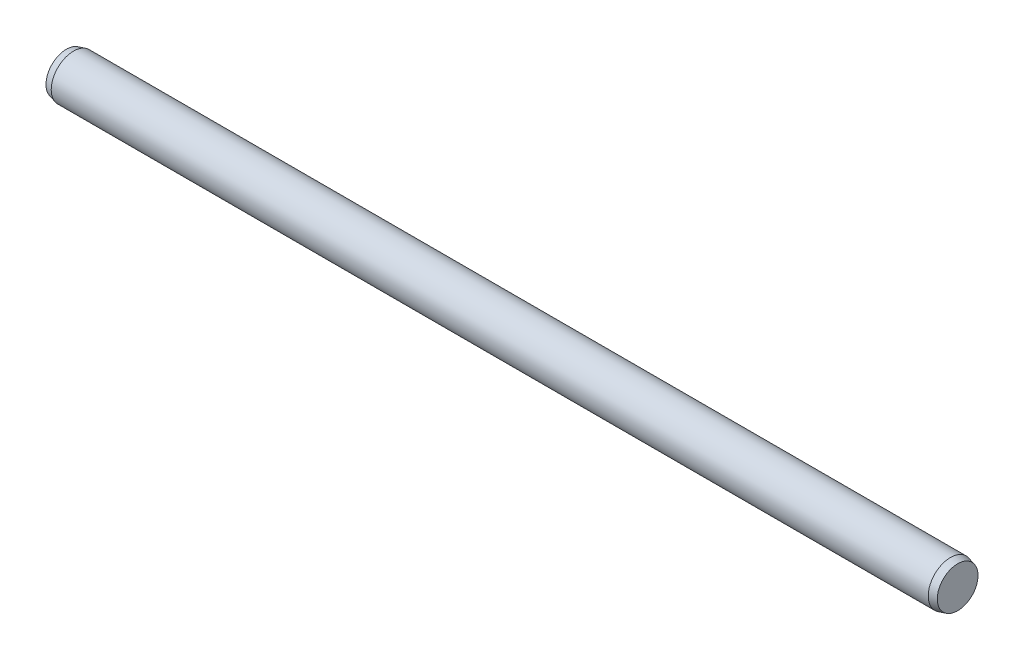
ISO-10303-21;
HEADER;
FILE_DESCRIPTION(('STEP AP214'),'2;1');
FILE_NAME('part.step','',(''),(''),'','','');
FILE_SCHEMA(('AUTOMOTIVE_DESIGN { 1 0 10303 214 1 1 1 1 }'));
ENDSEC;
DATA;
#1=APPLICATION_CONTEXT('core data for automotive mechanical design processes');
#2=APPLICATION_PROTOCOL_DEFINITION('international standard','automotive_design',2000,#1);
#3=PRODUCT_CONTEXT('',#1,'mechanical');
#4=PRODUCT('Part','Part','',(#3));
#5=PRODUCT_RELATED_PRODUCT_CATEGORY('part','',(#4));
#6=PRODUCT_DEFINITION_FORMATION('','',#4);
#7=PRODUCT_DEFINITION_CONTEXT('part definition',#1,'design');
#8=PRODUCT_DEFINITION('design','',#6,#7);
#9=PRODUCT_DEFINITION_SHAPE('','',#8);
#10=(LENGTH_UNIT() NAMED_UNIT(*) SI_UNIT(.MILLI.,.METRE.));
#11=(NAMED_UNIT(*) PLANE_ANGLE_UNIT() SI_UNIT($,.RADIAN.));
#12=(NAMED_UNIT(*) SI_UNIT($,.STERADIAN.) SOLID_ANGLE_UNIT());
#13=UNCERTAINTY_MEASURE_WITH_UNIT(LENGTH_MEASURE(1.E-05),#10,'distance_accuracy_value','');
#14=(GEOMETRIC_REPRESENTATION_CONTEXT(3) GLOBAL_UNCERTAINTY_ASSIGNED_CONTEXT((#13)) GLOBAL_UNIT_ASSIGNED_CONTEXT((#10,
#11,#12)) REPRESENTATION_CONTEXT('',''));
#15=CARTESIAN_POINT('',(0.,0.,0.));
#16=DIRECTION('',(0.,0.,1.));
#17=DIRECTION('',(1.,0.,0.));
#18=AXIS2_PLACEMENT_3D('',#15,#16,#17);
#19=CARTESIAN_POINT('',(-49.2,0.,0.));
#20=DIRECTION('',(1.,0.,0.));
#21=DIRECTION('',(0.,0.,-1.));
#22=AXIS2_PLACEMENT_3D('',#19,#20,#21);
#23=CYLINDRICAL_SURFACE('',#22,2.5);
#24=CARTESIAN_POINT('',(-49.2,0.,0.));
#25=DIRECTION('',(-1.,0.,0.));
#26=DIRECTION('',(0.,0.,1.));
#27=AXIS2_PLACEMENT_3D('',#24,#25,#26);
#28=CIRCLE('',#27,2.5);
#29=CARTESIAN_POINT('',(-49.2,0.,2.5));
#30=VERTEX_POINT('',#29);
#31=EDGE_CURVE('E46',#30,#30,#28,.T.);
#32=ORIENTED_EDGE('',*,*,#31,.F.);
#33=EDGE_LOOP('',(#32));
#34=FACE_BOUND('',#33,.T.);
#35=CARTESIAN_POINT('',(49.2,0.,0.));
#36=DIRECTION('',(1.,0.,0.));
#37=DIRECTION('',(0.,0.,-1.));
#38=AXIS2_PLACEMENT_3D('',#35,#36,#37);
#39=CIRCLE('',#38,2.5);
#40=CARTESIAN_POINT('',(49.2,0.,-2.5));
#41=VERTEX_POINT('',#40);
#42=EDGE_CURVE('E10',#41,#41,#39,.T.);
#43=ORIENTED_EDGE('',*,*,#42,.F.);
#44=EDGE_LOOP('',(#43));
#45=FACE_BOUND('',#44,.T.);
#46=ADVANCED_FACE('F32',(#34,#45),#23,.T.);
#47=CARTESIAN_POINT('',(49.2,0.,0.));
#48=DIRECTION('',(-1.,0.,0.));
#49=DIRECTION('',(0.,0.,-1.));
#50=AXIS2_PLACEMENT_3D('',#47,#48,#49);
#51=CONICAL_SURFACE('',#50,2.5,0.26179938779915);
#52=CARTESIAN_POINT('',(50.,0.,0.));
#53=DIRECTION('',(1.,0.,0.));
#54=DIRECTION('',(0.,0.,-1.));
#55=AXIS2_PLACEMENT_3D('',#52,#53,#54);
#56=CIRCLE('',#55,2.2856406460551);
#57=CARTESIAN_POINT('',(50.,0.,-2.2856406460551));
#58=VERTEX_POINT('',#57);
#59=EDGE_CURVE('E38',#58,#58,#56,.T.);
#60=ORIENTED_EDGE('',*,*,#59,.F.);
#61=EDGE_LOOP('',(#60));
#62=FACE_BOUND('',#61,.T.);
#63=ORIENTED_EDGE('',*,*,#42,.T.);
#64=EDGE_LOOP('',(#63));
#65=FACE_BOUND('',#64,.T.);
#66=ADVANCED_FACE('F56',(#62,#65),#51,.T.);
#67=CARTESIAN_POINT('',(50.,0.,0.));
#68=DIRECTION('',(1.,0.,0.));
#69=DIRECTION('',(0.,0.,-1.));
#70=AXIS2_PLACEMENT_3D('',#67,#68,#69);
#71=PLANE('',#70);
#72=ORIENTED_EDGE('',*,*,#59,.T.);
#73=EDGE_LOOP('',(#72));
#74=FACE_BOUND('',#73,.T.);
#75=ADVANCED_FACE('F60',(#74),#71,.T.);
#76=CARTESIAN_POINT('',(-49.2,0.,0.));
#77=DIRECTION('',(1.,0.,0.));
#78=DIRECTION('',(0.,0.,1.));
#79=AXIS2_PLACEMENT_3D('',#76,#77,#78);
#80=CONICAL_SURFACE('',#79,2.5,0.26179938779915);
#81=CARTESIAN_POINT('',(-50.,0.,0.));
#82=DIRECTION('',(-1.,0.,0.));
#83=DIRECTION('',(0.,0.,1.));
#84=AXIS2_PLACEMENT_3D('',#81,#82,#83);
#85=CIRCLE('',#84,2.2856406460551);
#86=CARTESIAN_POINT('',(-50.,0.,2.2856406460551));
#87=VERTEX_POINT('',#86);
#88=EDGE_CURVE('E42',#87,#87,#85,.T.);
#89=ORIENTED_EDGE('',*,*,#88,.F.);
#90=EDGE_LOOP('',(#89));
#91=FACE_BOUND('',#90,.T.);
#92=ORIENTED_EDGE('',*,*,#31,.T.);
#93=EDGE_LOOP('',(#92));
#94=FACE_BOUND('',#93,.T.);
#95=ADVANCED_FACE('F52',(#91,#94),#80,.T.);
#96=CARTESIAN_POINT('',(-50.,0.,0.));
#97=DIRECTION('',(-1.,0.,0.));
#98=DIRECTION('',(0.,0.,1.));
#99=AXIS2_PLACEMENT_3D('',#96,#97,#98);
#100=PLANE('',#99);
#101=ORIENTED_EDGE('',*,*,#88,.T.);
#102=EDGE_LOOP('',(#101));
#103=FACE_BOUND('',#102,.T.);
#104=ADVANCED_FACE('F69',(#103),#100,.T.);
#105=CLOSED_SHELL('',(#46,#66,#75,#95,#104));
#106=MANIFOLD_SOLID_BREP('B2',#105);
#107=ADVANCED_BREP_SHAPE_REPRESENTATION('',(#18,#106),#14);
#108=SHAPE_DEFINITION_REPRESENTATION(#9,#107);
ENDSEC;
END-ISO-10303-21;
